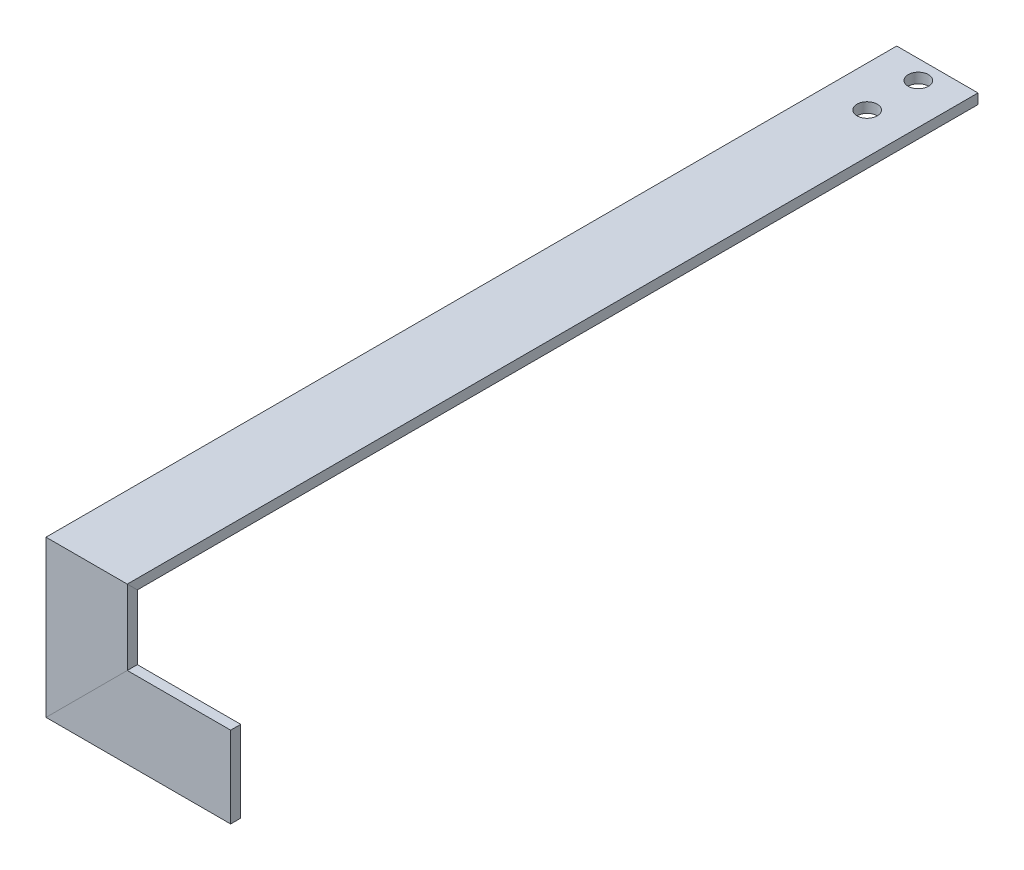
ISO-10303-21;
HEADER;
FILE_DESCRIPTION(('STEP AP214'),'2;1');
FILE_NAME('part.step','',(''),(''),'','','');
FILE_SCHEMA(('AUTOMOTIVE_DESIGN { 1 0 10303 214 1 1 1 1 }'));
ENDSEC;
DATA;
#1=APPLICATION_CONTEXT('core data for automotive mechanical design processes');
#2=APPLICATION_PROTOCOL_DEFINITION('international standard','automotive_design',2000,#1);
#3=PRODUCT_CONTEXT('',#1,'mechanical');
#4=PRODUCT('Part','Part','',(#3));
#5=PRODUCT_RELATED_PRODUCT_CATEGORY('part','',(#4));
#6=PRODUCT_DEFINITION_FORMATION('','',#4);
#7=PRODUCT_DEFINITION_CONTEXT('part definition',#1,'design');
#8=PRODUCT_DEFINITION('design','',#6,#7);
#9=PRODUCT_DEFINITION_SHAPE('','',#8);
#10=(LENGTH_UNIT() NAMED_UNIT(*) SI_UNIT(.MILLI.,.METRE.));
#11=(NAMED_UNIT(*) PLANE_ANGLE_UNIT() SI_UNIT($,.RADIAN.));
#12=(NAMED_UNIT(*) SI_UNIT($,.STERADIAN.) SOLID_ANGLE_UNIT());
#13=UNCERTAINTY_MEASURE_WITH_UNIT(LENGTH_MEASURE(1.E-05),#10,'distance_accuracy_value','');
#14=(GEOMETRIC_REPRESENTATION_CONTEXT(3) GLOBAL_UNCERTAINTY_ASSIGNED_CONTEXT((#13)) GLOBAL_UNIT_ASSIGNED_CONTEXT((#10,
#11,#12)) REPRESENTATION_CONTEXT('',''));
#15=CARTESIAN_POINT('',(0.,0.,0.));
#16=DIRECTION('',(0.,0.,1.));
#17=DIRECTION('',(1.,0.,0.));
#18=AXIS2_PLACEMENT_3D('',#15,#16,#17);
#19=CARTESIAN_POINT('',(90.,-69.,528.55));
#20=DIRECTION('',(1.,0.,0.));
#21=DIRECTION('',(0.,1.,0.));
#22=AXIS2_PLACEMENT_3D('',#19,#20,#21);
#23=PLANE('',#22);
#24=DIRECTION('',(0.,0.,1.));
#25=VECTOR('',#24,1.);
#26=CARTESIAN_POINT('',(90.,-43.6,531.705));
#27=LINE('',#26,#25);
#28=CARTESIAN_POINT('',(90.,-43.6,525.395));
#29=VERTEX_POINT('',#28);
#30=CARTESIAN_POINT('',(90.,-43.6,531.705));
#31=VERTEX_POINT('',#30);
#32=EDGE_CURVE('E86',#29,#31,#27,.T.);
#33=ORIENTED_EDGE('',*,*,#32,.T.);
#34=DIRECTION('',(0.,-1.,0.));
#35=VECTOR('',#34,1.);
#36=CARTESIAN_POINT('',(90.,-94.4,531.705));
#37=LINE('',#36,#35);
#38=CARTESIAN_POINT('',(90.,-94.4,531.705));
#39=VERTEX_POINT('',#38);
#40=EDGE_CURVE('E84',#31,#39,#37,.T.);
#41=ORIENTED_EDGE('',*,*,#40,.T.);
#42=DIRECTION('',(0.,0.,-1.));
#43=VECTOR('',#42,1.);
#44=CARTESIAN_POINT('',(90.,-94.4,531.705));
#45=LINE('',#44,#43);
#46=CARTESIAN_POINT('',(90.,-94.4,525.395));
#47=VERTEX_POINT('',#46);
#48=EDGE_CURVE('E81',#39,#47,#45,.T.);
#49=ORIENTED_EDGE('',*,*,#48,.T.);
#50=DIRECTION('',(0.,1.,0.));
#51=VECTOR('',#50,1.);
#52=CARTESIAN_POINT('',(90.,-94.4,525.395));
#53=LINE('',#52,#51);
#54=EDGE_CURVE('E101',#47,#29,#53,.T.);
#55=ORIENTED_EDGE('',*,*,#54,.T.);
#56=EDGE_LOOP('',(#33,#41,#49,#55));
#57=FACE_BOUND('',#56,.T.);
#58=ADVANCED_FACE('F35',(#57),#23,.T.);
#59=CARTESIAN_POINT('',(0.,0.,0.));
#60=DIRECTION('',(0.,0.,1.));
#61=DIRECTION('',(1.,0.,0.));
#62=AXIS2_PLACEMENT_3D('',#59,#60,#61);
#63=PLANE('',#62);
#64=DIRECTION('',(0.,1.,0.));
#65=VECTOR('',#64,1.);
#66=CARTESIAN_POINT('',(25.4,3.155,0.));
#67=LINE('',#66,#65);
#68=CARTESIAN_POINT('',(25.4,-3.155,0.));
#69=VERTEX_POINT('',#68);
#70=CARTESIAN_POINT('',(25.4,3.155,0.));
#71=VERTEX_POINT('',#70);
#72=EDGE_CURVE('E143',#69,#71,#67,.T.);
#73=ORIENTED_EDGE('',*,*,#72,.F.);
#74=DIRECTION('',(1.,0.,0.));
#75=VECTOR('',#74,1.);
#76=CARTESIAN_POINT('',(-25.4,-3.155,0.));
#77=LINE('',#76,#75);
#78=CARTESIAN_POINT('',(-25.4,-3.155,0.));
#79=VERTEX_POINT('',#78);
#80=EDGE_CURVE('E149',#79,#69,#77,.T.);
#81=ORIENTED_EDGE('',*,*,#80,.F.);
#82=DIRECTION('',(0.,-1.,0.));
#83=VECTOR('',#82,1.);
#84=CARTESIAN_POINT('',(-25.4,3.155,0.));
#85=LINE('',#84,#83);
#86=CARTESIAN_POINT('',(-25.4,3.155,0.));
#87=VERTEX_POINT('',#86);
#88=EDGE_CURVE('E133',#87,#79,#85,.T.);
#89=ORIENTED_EDGE('',*,*,#88,.F.);
#90=DIRECTION('',(-1.,0.,0.));
#91=VECTOR('',#90,1.);
#92=CARTESIAN_POINT('',(-25.4,3.155,0.));
#93=LINE('',#92,#91);
#94=EDGE_CURVE('E139',#71,#87,#93,.T.);
#95=ORIENTED_EDGE('',*,*,#94,.F.);
#96=EDGE_LOOP('',(#73,#81,#89,#95));
#97=FACE_BOUND('',#96,.T.);
#98=ADVANCED_FACE('F354',(#97),#63,.F.);
#99=CARTESIAN_POINT('',(-28.04,-94.4,531.705));
#100=DIRECTION('',(0.,-1.,0.));
#101=DIRECTION('',(0.,0.,-1.));
#102=AXIS2_PLACEMENT_3D('',#99,#100,#101);
#103=PLANE('',#102);
#104=DIRECTION('',(0.,0.,1.));
#105=VECTOR('',#104,1.);
#106=CARTESIAN_POINT('',(-25.4,-94.4,531.705));
#107=LINE('',#106,#105);
#108=CARTESIAN_POINT('',(-25.4,-94.4,525.395));
#109=VERTEX_POINT('',#108);
#110=CARTESIAN_POINT('',(-25.4,-94.4,531.705));
#111=VERTEX_POINT('',#110);
#112=EDGE_CURVE('E117',#109,#111,#107,.T.);
#113=ORIENTED_EDGE('',*,*,#112,.F.);
#114=DIRECTION('',(1.,0.,0.));
#115=VECTOR('',#114,1.);
#116=CARTESIAN_POINT('',(-28.04,-94.4,525.395));
#117=LINE('',#116,#115);
#118=EDGE_CURVE('E99',#109,#47,#117,.T.);
#119=ORIENTED_EDGE('',*,*,#118,.T.);
#120=ORIENTED_EDGE('',*,*,#48,.F.);
#121=DIRECTION('',(1.,0.,0.));
#122=VECTOR('',#121,1.);
#123=CARTESIAN_POINT('',(-28.04,-94.4,531.705));
#124=LINE('',#123,#122);
#125=EDGE_CURVE('E38',#111,#39,#124,.T.);
#126=ORIENTED_EDGE('',*,*,#125,.F.);
#127=EDGE_LOOP('',(#113,#119,#120,#126));
#128=FACE_BOUND('',#127,.T.);
#129=ADVANCED_FACE('F96',(#128),#103,.T.);
#130=CARTESIAN_POINT('',(-28.04,-94.4,525.395));
#131=DIRECTION('',(0.,0.,-1.));
#132=DIRECTION('',(-1.,0.,0.));
#133=AXIS2_PLACEMENT_3D('',#130,#131,#132);
#134=PLANE('',#133);
#135=DIRECTION('',(-0.707106781186548,-0.707106781186548,0.));
#136=VECTOR('',#135,1.);
#137=CARTESIAN_POINT('',(23.58525,-45.4147500000001,525.395));
#138=LINE('',#137,#136);
#139=CARTESIAN_POINT('',(25.4,-43.6,525.395));
#140=VERTEX_POINT('',#139);
#141=EDGE_CURVE('E130',#140,#109,#138,.T.);
#142=ORIENTED_EDGE('',*,*,#141,.F.);
#143=DIRECTION('',(1.,0.,0.));
#144=VECTOR('',#143,1.);
#145=CARTESIAN_POINT('',(-28.04,-43.6,525.395));
#146=LINE('',#145,#144);
#147=EDGE_CURVE('E110',#140,#29,#146,.T.);
#148=ORIENTED_EDGE('',*,*,#147,.T.);
#149=ORIENTED_EDGE('',*,*,#54,.F.);
#150=ORIENTED_EDGE('',*,*,#118,.F.);
#151=EDGE_LOOP('',(#142,#148,#149,#150));
#152=FACE_BOUND('',#151,.T.);
#153=ADVANCED_FACE('F336',(#152),#134,.T.);
#154=CARTESIAN_POINT('',(-28.04,-43.6,531.705));
#155=DIRECTION('',(0.,1.,0.));
#156=DIRECTION('',(0.,0.,1.));
#157=AXIS2_PLACEMENT_3D('',#154,#155,#156);
#158=PLANE('',#157);
#159=DIRECTION('',(0.,0.,-1.));
#160=VECTOR('',#159,1.);
#161=CARTESIAN_POINT('',(25.4,-43.6,531.705));
#162=LINE('',#161,#160);
#163=CARTESIAN_POINT('',(25.4,-43.6,531.705));
#164=VERTEX_POINT('',#163);
#165=EDGE_CURVE('E127',#164,#140,#162,.T.);
#166=ORIENTED_EDGE('',*,*,#165,.F.);
#167=DIRECTION('',(1.,0.,0.));
#168=VECTOR('',#167,1.);
#169=CARTESIAN_POINT('',(-28.04,-43.6,531.705));
#170=LINE('',#169,#168);
#171=EDGE_CURVE('E100',#164,#31,#170,.T.);
#172=ORIENTED_EDGE('',*,*,#171,.T.);
#173=ORIENTED_EDGE('',*,*,#32,.F.);
#174=ORIENTED_EDGE('',*,*,#147,.F.);
#175=EDGE_LOOP('',(#166,#172,#173,#174));
#176=FACE_BOUND('',#175,.T.);
#177=ADVANCED_FACE('F234',(#176),#158,.T.);
#178=CARTESIAN_POINT('',(-28.04,-94.4,531.705));
#179=DIRECTION('',(0.,0.,1.));
#180=DIRECTION('',(1.,0.,0.));
#181=AXIS2_PLACEMENT_3D('',#178,#179,#180);
#182=PLANE('',#181);
#183=DIRECTION('',(0.707106781186548,0.707106781186548,0.));
#184=VECTOR('',#183,1.);
#185=CARTESIAN_POINT('',(23.58525,-45.4147500000001,531.705));
#186=LINE('',#185,#184);
#187=EDGE_CURVE('E105',#111,#164,#186,.T.);
#188=ORIENTED_EDGE('',*,*,#187,.F.);
#189=ORIENTED_EDGE('',*,*,#125,.T.);
#190=ORIENTED_EDGE('',*,*,#40,.F.);
#191=ORIENTED_EDGE('',*,*,#171,.F.);
#192=EDGE_LOOP('',(#188,#189,#190,#191));
#193=FACE_BOUND('',#192,.T.);
#194=ADVANCED_FACE('F103',(#193),#182,.T.);
#195=CARTESIAN_POINT('',(-25.4,3.5704999999999,531.705));
#196=DIRECTION('',(0.,0.,1.));
#197=DIRECTION('',(1.,0.,0.));
#198=AXIS2_PLACEMENT_3D('',#195,#196,#197);
#199=PLANE('',#198);
#200=DIRECTION('',(0.,-1.,0.));
#201=VECTOR('',#200,1.);
#202=CARTESIAN_POINT('',(-25.4,3.5704999999999,531.705));
#203=LINE('',#202,#201);
#204=CARTESIAN_POINT('',(-25.4,3.15499999999998,531.705));
#205=VERTEX_POINT('',#204);
#206=EDGE_CURVE('E119',#205,#111,#203,.T.);
#207=ORIENTED_EDGE('',*,*,#206,.T.);
#208=ORIENTED_EDGE('',*,*,#187,.T.);
#209=DIRECTION('',(0.,-1.,0.));
#210=VECTOR('',#209,1.);
#211=CARTESIAN_POINT('',(25.4,3.5704999999999,531.705));
#212=LINE('',#211,#210);
#213=CARTESIAN_POINT('',(25.4,3.15499999999998,531.705));
#214=VERTEX_POINT('',#213);
#215=EDGE_CURVE('E106',#214,#164,#212,.T.);
#216=ORIENTED_EDGE('',*,*,#215,.F.);
#217=DIRECTION('',(1.,0.,0.));
#218=VECTOR('',#217,1.);
#219=CARTESIAN_POINT('',(-25.4,3.155,531.705));
#220=LINE('',#219,#218);
#221=EDGE_CURVE('E137',#205,#214,#220,.T.);
#222=ORIENTED_EDGE('',*,*,#221,.F.);
#223=EDGE_LOOP('',(#207,#208,#216,#222));
#224=FACE_BOUND('',#223,.T.);
#225=ADVANCED_FACE('F226',(#224),#199,.T.);
#226=CARTESIAN_POINT('',(25.4,3.5704999999999,531.705));
#227=DIRECTION('',(1.,0.,0.));
#228=DIRECTION('',(0.,0.,-1.));
#229=AXIS2_PLACEMENT_3D('',#226,#227,#228);
#230=PLANE('',#229);
#231=ORIENTED_EDGE('',*,*,#215,.T.);
#232=ORIENTED_EDGE('',*,*,#165,.T.);
#233=DIRECTION('',(0.,-1.,0.));
#234=VECTOR('',#233,1.);
#235=CARTESIAN_POINT('',(25.4,3.5704999999999,525.395));
#236=LINE('',#235,#234);
#237=CARTESIAN_POINT('',(25.4,-3.15500000000007,525.395));
#238=VERTEX_POINT('',#237);
#239=EDGE_CURVE('E108',#238,#140,#236,.T.);
#240=ORIENTED_EDGE('',*,*,#239,.F.);
#241=DIRECTION('',(0.,-0.707106781186548,-0.707106781186548));
#242=VECTOR('',#241,1.);
#243=CARTESIAN_POINT('',(25.4,-262.6975,265.8525));
#244=LINE('',#243,#242);
#245=EDGE_CURVE('E44',#214,#238,#244,.T.);
#246=ORIENTED_EDGE('',*,*,#245,.F.);
#247=EDGE_LOOP('',(#231,#232,#240,#246));
#248=FACE_BOUND('',#247,.T.);
#249=ADVANCED_FACE('F224',(#248),#230,.T.);
#250=CARTESIAN_POINT('',(-25.4,3.5704999999999,525.395));
#251=DIRECTION('',(0.,0.,-1.));
#252=DIRECTION('',(-1.,0.,0.));
#253=AXIS2_PLACEMENT_3D('',#250,#251,#252);
#254=PLANE('',#253);
#255=ORIENTED_EDGE('',*,*,#239,.T.);
#256=ORIENTED_EDGE('',*,*,#141,.T.);
#257=DIRECTION('',(0.,-1.,0.));
#258=VECTOR('',#257,1.);
#259=CARTESIAN_POINT('',(-25.4,3.5704999999999,525.395));
#260=LINE('',#259,#258);
#261=CARTESIAN_POINT('',(-25.4,-3.15500000000005,525.395));
#262=VERTEX_POINT('',#261);
#263=EDGE_CURVE('E122',#262,#109,#260,.T.);
#264=ORIENTED_EDGE('',*,*,#263,.F.);
#265=DIRECTION('',(-1.,0.,0.));
#266=VECTOR('',#265,1.);
#267=CARTESIAN_POINT('',(-25.4,-3.155,525.395));
#268=LINE('',#267,#266);
#269=EDGE_CURVE('E11',#238,#262,#268,.T.);
#270=ORIENTED_EDGE('',*,*,#269,.F.);
#271=EDGE_LOOP('',(#255,#256,#264,#270));
#272=FACE_BOUND('',#271,.T.);
#273=ADVANCED_FACE('F218',(#272),#254,.T.);
#274=CARTESIAN_POINT('',(-25.4,3.5704999999999,531.705));
#275=DIRECTION('',(-1.,0.,0.));
#276=DIRECTION('',(0.,0.,1.));
#277=AXIS2_PLACEMENT_3D('',#274,#275,#276);
#278=PLANE('',#277);
#279=ORIENTED_EDGE('',*,*,#263,.T.);
#280=ORIENTED_EDGE('',*,*,#112,.T.);
#281=ORIENTED_EDGE('',*,*,#206,.F.);
#282=DIRECTION('',(0.,0.707106781186548,0.707106781186548));
#283=VECTOR('',#282,1.);
#284=CARTESIAN_POINT('',(-25.4,-262.6975,265.8525));
#285=LINE('',#284,#283);
#286=EDGE_CURVE('E134',#262,#205,#285,.T.);
#287=ORIENTED_EDGE('',*,*,#286,.F.);
#288=EDGE_LOOP('',(#279,#280,#281,#287));
#289=FACE_BOUND('',#288,.T.);
#290=ADVANCED_FACE('F191',(#289),#278,.T.);
#291=CARTESIAN_POINT('',(-25.4,3.155,0.));
#292=DIRECTION('',(0.,1.,0.));
#293=DIRECTION('',(0.,0.,1.));
#294=AXIS2_PLACEMENT_3D('',#291,#292,#293);
#295=PLANE('',#294);
#296=CARTESIAN_POINT('',(6.52256026967279E-12,3.155,11.8922046657244));
#297=DIRECTION('',(0.,1.,0.));
#298=DIRECTION('',(0.,0.,1.));
#299=AXIS2_PLACEMENT_3D('',#296,#297,#298);
#300=CIRCLE('',#299,6.35000000000004);
#301=CARTESIAN_POINT('',(6.52256026967279E-12,3.155,18.2422046657244));
#302=VERTEX_POINT('',#301);
#303=EDGE_CURVE('E171',#302,#302,#300,.T.);
#304=ORIENTED_EDGE('',*,*,#303,.F.);
#305=EDGE_LOOP('',(#304));
#306=FACE_BOUND('',#305,.T.);
#307=CARTESIAN_POINT('',(6.64746035994312E-12,3.155,43.8922046657244));
#308=DIRECTION('',(0.,1.,0.));
#309=DIRECTION('',(0.,0.,1.));
#310=AXIS2_PLACEMENT_3D('',#307,#308,#309);
#311=CIRCLE('',#310,6.35000000000007);
#312=CARTESIAN_POINT('',(6.64746035994312E-12,3.155,50.2422046657245));
#313=VERTEX_POINT('',#312);
#314=EDGE_CURVE('E165',#313,#313,#311,.T.);
#315=ORIENTED_EDGE('',*,*,#314,.F.);
#316=EDGE_LOOP('',(#315));
#317=FACE_BOUND('',#316,.T.);
#318=DIRECTION('',(0.,0.,1.));
#319=VECTOR('',#318,1.);
#320=CARTESIAN_POINT('',(-25.4,3.155,0.));
#321=LINE('',#320,#319);
#322=EDGE_CURVE('E142',#87,#205,#321,.T.);
#323=ORIENTED_EDGE('',*,*,#322,.T.);
#324=ORIENTED_EDGE('',*,*,#221,.T.);
#325=DIRECTION('',(0.,0.,1.));
#326=VECTOR('',#325,1.);
#327=CARTESIAN_POINT('',(25.4,3.155,0.));
#328=LINE('',#327,#326);
#329=EDGE_CURVE('E138',#71,#214,#328,.T.);
#330=ORIENTED_EDGE('',*,*,#329,.F.);
#331=ORIENTED_EDGE('',*,*,#94,.T.);
#332=EDGE_LOOP('',(#323,#324,#330,#331));
#333=FACE_BOUND('',#332,.T.);
#334=ADVANCED_FACE('F187',(#306,#317,#333),#295,.T.);
#335=CARTESIAN_POINT('',(25.4,3.155,0.));
#336=DIRECTION('',(1.,0.,0.));
#337=DIRECTION('',(0.,0.,-1.));
#338=AXIS2_PLACEMENT_3D('',#335,#336,#337);
#339=PLANE('',#338);
#340=ORIENTED_EDGE('',*,*,#329,.T.);
#341=ORIENTED_EDGE('',*,*,#245,.T.);
#342=DIRECTION('',(0.,0.,1.));
#343=VECTOR('',#342,1.);
#344=CARTESIAN_POINT('',(25.4,-3.155,0.));
#345=LINE('',#344,#343);
#346=EDGE_CURVE('E146',#69,#238,#345,.T.);
#347=ORIENTED_EDGE('',*,*,#346,.F.);
#348=ORIENTED_EDGE('',*,*,#72,.T.);
#349=EDGE_LOOP('',(#340,#341,#347,#348));
#350=FACE_BOUND('',#349,.T.);
#351=ADVANCED_FACE('F190',(#350),#339,.T.);
#352=CARTESIAN_POINT('',(-25.4,-3.155,0.));
#353=DIRECTION('',(0.,-1.,0.));
#354=DIRECTION('',(0.,0.,-1.));
#355=AXIS2_PLACEMENT_3D('',#352,#353,#354);
#356=PLANE('',#355);
#357=CARTESIAN_POINT('',(6.52256026967279E-12,-3.155,11.8922046657244));
#358=DIRECTION('',(0.,1.,0.));
#359=DIRECTION('',(0.,0.,1.));
#360=AXIS2_PLACEMENT_3D('',#357,#358,#359);
#361=CIRCLE('',#360,6.35000000000004);
#362=CARTESIAN_POINT('',(6.52256026967279E-12,-3.155,18.2422046657244));
#363=VERTEX_POINT('',#362);
#364=EDGE_CURVE('E168',#363,#363,#361,.T.);
#365=ORIENTED_EDGE('',*,*,#364,.T.);
#366=EDGE_LOOP('',(#365));
#367=FACE_BOUND('',#366,.T.);
#368=CARTESIAN_POINT('',(6.64746035994312E-12,-3.155,43.8922046657244));
#369=DIRECTION('',(0.,1.,0.));
#370=DIRECTION('',(0.,0.,1.));
#371=AXIS2_PLACEMENT_3D('',#368,#369,#370);
#372=CIRCLE('',#371,6.35000000000007);
#373=CARTESIAN_POINT('',(6.64746035994312E-12,-3.155,50.2422046657245));
#374=VERTEX_POINT('',#373);
#375=EDGE_CURVE('E91',#374,#374,#372,.T.);
#376=ORIENTED_EDGE('',*,*,#375,.T.);
#377=EDGE_LOOP('',(#376));
#378=FACE_BOUND('',#377,.T.);
#379=ORIENTED_EDGE('',*,*,#346,.T.);
#380=ORIENTED_EDGE('',*,*,#269,.T.);
#381=DIRECTION('',(0.,0.,1.));
#382=VECTOR('',#381,1.);
#383=CARTESIAN_POINT('',(-25.4,-3.155,0.));
#384=LINE('',#383,#382);
#385=EDGE_CURVE('E152',#79,#262,#384,.T.);
#386=ORIENTED_EDGE('',*,*,#385,.F.);
#387=ORIENTED_EDGE('',*,*,#80,.T.);
#388=EDGE_LOOP('',(#379,#380,#386,#387));
#389=FACE_BOUND('',#388,.T.);
#390=ADVANCED_FACE('F177',(#367,#378,#389),#356,.T.);
#391=CARTESIAN_POINT('',(-25.4,3.155,0.));
#392=DIRECTION('',(-1.,0.,0.));
#393=DIRECTION('',(0.,0.,1.));
#394=AXIS2_PLACEMENT_3D('',#391,#392,#393);
#395=PLANE('',#394);
#396=ORIENTED_EDGE('',*,*,#385,.T.);
#397=ORIENTED_EDGE('',*,*,#286,.T.);
#398=ORIENTED_EDGE('',*,*,#322,.F.);
#399=ORIENTED_EDGE('',*,*,#88,.T.);
#400=EDGE_LOOP('',(#396,#397,#398,#399));
#401=FACE_BOUND('',#400,.T.);
#402=ADVANCED_FACE('F201',(#401),#395,.T.);
#403=CARTESIAN_POINT('',(6.64746035994312E-12,-3.155,43.8922046657244));
#404=DIRECTION('',(0.,1.,0.));
#405=DIRECTION('',(0.,0.,1.));
#406=AXIS2_PLACEMENT_3D('',#403,#404,#405);
#407=CYLINDRICAL_SURFACE('',#406,6.35000000000007);
#408=ORIENTED_EDGE('',*,*,#375,.F.);
#409=EDGE_LOOP('',(#408));
#410=FACE_BOUND('',#409,.T.);
#411=ORIENTED_EDGE('',*,*,#314,.T.);
#412=EDGE_LOOP('',(#411));
#413=FACE_BOUND('',#412,.T.);
#414=ADVANCED_FACE('F183',(#410,#413),#407,.F.);
#415=CARTESIAN_POINT('',(6.52256026967279E-12,-3.155,11.8922046657244));
#416=DIRECTION('',(0.,1.,0.));
#417=DIRECTION('',(0.,0.,1.));
#418=AXIS2_PLACEMENT_3D('',#415,#416,#417);
#419=CYLINDRICAL_SURFACE('',#418,6.35000000000004);
#420=ORIENTED_EDGE('',*,*,#364,.F.);
#421=EDGE_LOOP('',(#420));
#422=FACE_BOUND('',#421,.T.);
#423=ORIENTED_EDGE('',*,*,#303,.T.);
#424=EDGE_LOOP('',(#423));
#425=FACE_BOUND('',#424,.T.);
#426=ADVANCED_FACE('F180',(#422,#425),#419,.F.);
#427=CLOSED_SHELL('',(#58,#98,#129,#153,#177,#194,#225,#249,#273,#290,#334,#351,#390,#402,#414,#426));
#428=MANIFOLD_SOLID_BREP('B2',#427);
#429=ADVANCED_BREP_SHAPE_REPRESENTATION('',(#18,#428),#14);
#430=SHAPE_DEFINITION_REPRESENTATION(#9,#429);
ENDSEC;
END-ISO-10303-21;
